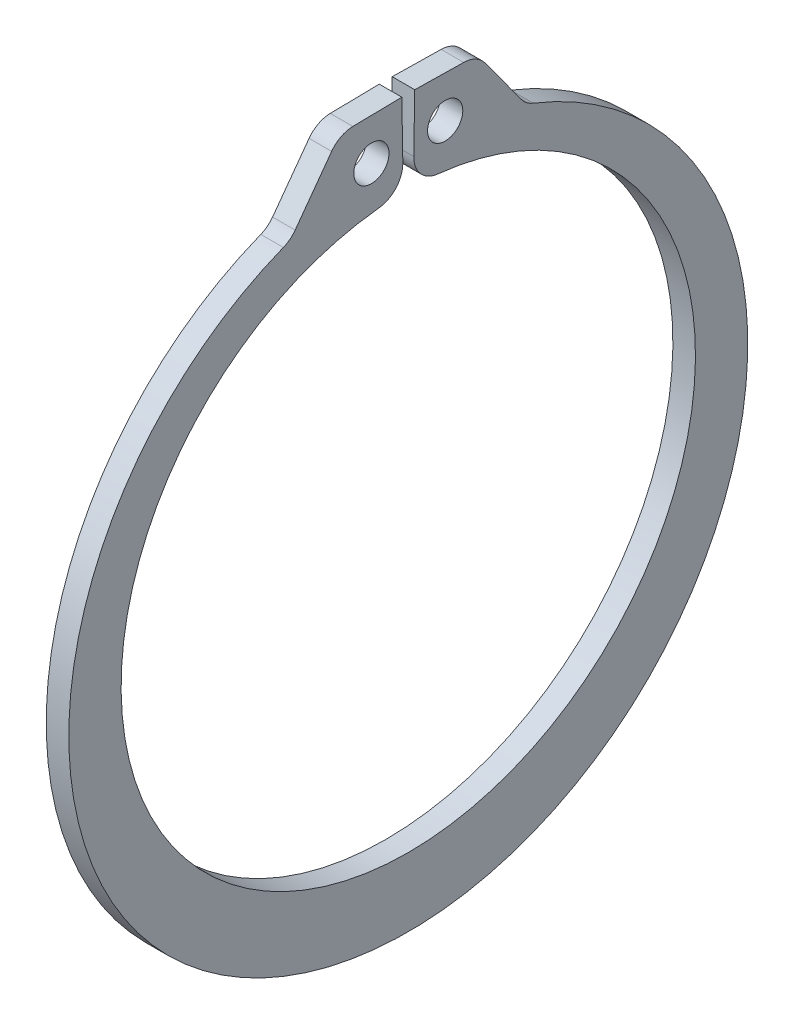
ISO-10303-21;
HEADER;
FILE_DESCRIPTION(('STEP AP214'),'2;1');
FILE_NAME('part.step','',(''),(''),'','','');
FILE_SCHEMA(('AUTOMOTIVE_DESIGN { 1 0 10303 214 1 1 1 1 }'));
ENDSEC;
DATA;
#1=APPLICATION_CONTEXT('core data for automotive mechanical design processes');
#2=APPLICATION_PROTOCOL_DEFINITION('international standard','automotive_design',2000,#1);
#3=PRODUCT_CONTEXT('',#1,'mechanical');
#4=PRODUCT('Part','Part','',(#3));
#5=PRODUCT_RELATED_PRODUCT_CATEGORY('part','',(#4));
#6=PRODUCT_DEFINITION_FORMATION('','',#4);
#7=PRODUCT_DEFINITION_CONTEXT('part definition',#1,'design');
#8=PRODUCT_DEFINITION('design','',#6,#7);
#9=PRODUCT_DEFINITION_SHAPE('','',#8);
#10=(LENGTH_UNIT() NAMED_UNIT(*) SI_UNIT(.MILLI.,.METRE.));
#11=(NAMED_UNIT(*) PLANE_ANGLE_UNIT() SI_UNIT($,.RADIAN.));
#12=(NAMED_UNIT(*) SI_UNIT($,.STERADIAN.) SOLID_ANGLE_UNIT());
#13=UNCERTAINTY_MEASURE_WITH_UNIT(LENGTH_MEASURE(1.E-05),#10,'distance_accuracy_value','');
#14=(GEOMETRIC_REPRESENTATION_CONTEXT(3) GLOBAL_UNCERTAINTY_ASSIGNED_CONTEXT((#13)) GLOBAL_UNIT_ASSIGNED_CONTEXT((#10,
#11,#12)) REPRESENTATION_CONTEXT('',''));
#15=CARTESIAN_POINT('',(0.,0.,0.));
#16=DIRECTION('',(0.,0.,1.));
#17=DIRECTION('',(1.,0.,0.));
#18=AXIS2_PLACEMENT_3D('',#15,#16,#17);
#19=CARTESIAN_POINT('',(0.635,-0.918943194300723,0.));
#20=DIRECTION('',(1.,0.,0.));
#21=DIRECTION('',(0.,0.,-1.));
#22=AXIS2_PLACEMENT_3D('',#19,#20,#21);
#23=PLANE('',#22);
#24=CARTESIAN_POINT('',(0.635,18.4577966131539,2.07504900844419));
#25=DIRECTION('',(1.,0.,0.));
#26=DIRECTION('',(0.,0.,-1.));
#27=AXIS2_PLACEMENT_3D('',#24,#25,#26);
#28=CIRCLE('',#27,0.990599999999999);
#29=CARTESIAN_POINT('',(0.635,18.4577966131539,1.08444900844419));
#30=VERTEX_POINT('',#29);
#31=EDGE_CURVE('E185',#30,#30,#28,.T.);
#32=ORIENTED_EDGE('',*,*,#31,.F.);
#33=EDGE_LOOP('',(#32));
#34=FACE_BOUND('',#33,.T.);
#35=DIRECTION('',(0.,0.807275838679021,0.590174313474488));
#36=VECTOR('',#35,1.);
#37=CARTESIAN_POINT('',(0.635,20.7636536196733,-3.86816486233792));
#38=LINE('',#37,#36);
#39=CARTESIAN_POINT('',(0.635,17.3506623233126,-6.36329688377948));
#40=VERTEX_POINT('',#39);
#41=CARTESIAN_POINT('',(0.635,20.157616095665,-4.31122008898346));
#42=VERTEX_POINT('',#41);
#43=EDGE_CURVE('E191',#40,#42,#38,.T.);
#44=ORIENTED_EDGE('',*,*,#43,.T.);
#45=CARTESIAN_POINT('',(0.635,19.265685655711,-3.09118411398786));
#46=DIRECTION('',(1.,0.,0.));
#47=DIRECTION('',(0.,0.,-1.));
#48=AXIS2_PLACEMENT_3D('',#45,#46,#47);
#49=CIRCLE('',#48,1.5113);
#50=CARTESIAN_POINT('',(0.635,20.7767554774009,-3.11755993583652));
#51=VERTEX_POINT('',#50);
#52=EDGE_CURVE('E230',#42,#51,#49,.T.);
#53=ORIENTED_EDGE('',*,*,#52,.T.);
#54=DIRECTION('',(0.,0.0174524064372835,0.999847695156391));
#55=VECTOR('',#54,1.);
#56=CARTESIAN_POINT('',(0.635,20.8248277947173,-0.363498721275741));
#57=LINE('',#56,#55);
#58=CARTESIAN_POINT('',(0.635,20.8248277947173,-0.363498721275741));
#59=VERTEX_POINT('',#58);
#60=EDGE_CURVE('E194',#51,#59,#57,.T.);
#61=ORIENTED_EDGE('',*,*,#60,.T.);
#62=DIRECTION('',(0.,-0.999847695156391,0.0174524064372839));
#63=VECTOR('',#62,1.);
#64=CARTESIAN_POINT('',(0.635,16.1519396066344,-0.28193315455045));
#65=LINE('',#64,#63);
#66=CARTESIAN_POINT('',(0.635,17.5982547446913,-0.307178679191898));
#67=VERTEX_POINT('',#66);
#68=EDGE_CURVE('E162',#59,#67,#65,.T.);
#69=ORIENTED_EDGE('',*,*,#68,.T.);
#70=CARTESIAN_POINT('',(0.635,17.5718789228426,-1.81824850088175));
#71=DIRECTION('',(1.,0.,0.));
#72=DIRECTION('',(0.,0.,-1.));
#73=AXIS2_PLACEMENT_3D('',#70,#71,#72);
#74=CIRCLE('',#73,1.5113);
#75=CARTESIAN_POINT('',(0.635,16.068605312621,-1.66269740698892));
#76=VERTEX_POINT('',#75);
#77=EDGE_CURVE('E228',#67,#76,#74,.T.);
#78=ORIENTED_EDGE('',*,*,#77,.T.);
#79=CARTESIAN_POINT('',(0.635,0.,0.));
#80=DIRECTION('',(-1.,0.,0.));
#81=DIRECTION('',(0.,0.,-1.));
#82=AXIS2_PLACEMENT_3D('',#79,#80,#81);
#83=CIRCLE('',#82,16.1544);
#84=CARTESIAN_POINT('',(0.635,16.068605312621,1.66269740698892));
#85=VERTEX_POINT('',#84);
#86=EDGE_CURVE('E197',#76,#85,#83,.T.);
#87=ORIENTED_EDGE('',*,*,#86,.T.);
#88=CARTESIAN_POINT('',(0.635,17.5718789228426,1.81824850088175));
#89=DIRECTION('',(1.,0.,0.));
#90=DIRECTION('',(0.,0.,-1.));
#91=AXIS2_PLACEMENT_3D('',#88,#89,#90);
#92=CIRCLE('',#91,1.5113);
#93=CARTESIAN_POINT('',(0.635,17.5982547446913,0.307178679191899));
#94=VERTEX_POINT('',#93);
#95=EDGE_CURVE('E226',#85,#94,#92,.T.);
#96=ORIENTED_EDGE('',*,*,#95,.T.);
#97=DIRECTION('',(0.,0.999847695156391,0.0174524064372836));
#98=VECTOR('',#97,1.);
#99=CARTESIAN_POINT('',(0.635,16.1519396066344,0.281933154550452));
#100=LINE('',#99,#98);
#101=CARTESIAN_POINT('',(0.635,20.8248277947173,0.363498721275741));
#102=VERTEX_POINT('',#101);
#103=EDGE_CURVE('E200',#94,#102,#100,.T.);
#104=ORIENTED_EDGE('',*,*,#103,.T.);
#105=DIRECTION('',(0.,-0.0174524064372835,0.999847695156391));
#106=VECTOR('',#105,1.);
#107=CARTESIAN_POINT('',(0.635,20.8248277947173,0.363498721275741));
#108=LINE('',#107,#106);
#109=CARTESIAN_POINT('',(0.635,20.7767554774009,3.11755993583652));
#110=VERTEX_POINT('',#109);
#111=EDGE_CURVE('E202',#102,#110,#108,.T.);
#112=ORIENTED_EDGE('',*,*,#111,.T.);
#113=CARTESIAN_POINT('',(0.635,19.265685655711,3.09118411398785));
#114=DIRECTION('',(1.,0.,0.));
#115=DIRECTION('',(0.,0.,-1.));
#116=AXIS2_PLACEMENT_3D('',#113,#114,#115);
#117=CIRCLE('',#116,1.5113);
#118=CARTESIAN_POINT('',(0.635,20.157616095665,4.31122008898346));
#119=VERTEX_POINT('',#118);
#120=EDGE_CURVE('E63',#110,#119,#117,.T.);
#121=ORIENTED_EDGE('',*,*,#120,.T.);
#122=DIRECTION('',(0.,-0.807275838679021,0.590174313474488));
#123=VECTOR('',#122,1.);
#124=CARTESIAN_POINT('',(0.635,20.7636536196733,3.86816486233792));
#125=LINE('',#124,#123);
#126=CARTESIAN_POINT('',(0.635,17.3506623233126,6.36329688377949));
#127=VERTEX_POINT('',#126);
#128=EDGE_CURVE('E204',#119,#127,#125,.T.);
#129=ORIENTED_EDGE('',*,*,#128,.T.);
#130=CARTESIAN_POINT('',(0.635,18.2425927632666,7.5833328587751));
#131=DIRECTION('',(1.,0.,0.));
#132=DIRECTION('',(0.,0.,-1.));
#133=AXIS2_PLACEMENT_3D('',#130,#131,#132);
#134=CIRCLE('',#133,1.5113);
#135=CARTESIAN_POINT('',(0.635,16.837339847275,7.02719264974764));
#136=VERTEX_POINT('',#135);
#137=EDGE_CURVE('E11',#127,#136,#134,.F.);
#138=ORIENTED_EDGE('',*,*,#137,.T.);
#139=CARTESIAN_POINT('',(0.635,-0.918943194300723,0.));
#140=DIRECTION('',(1.,0.,0.));
#141=DIRECTION('',(0.,0.,-1.));
#142=AXIS2_PLACEMENT_3D('',#139,#140,#141);
#143=CIRCLE('',#142,19.0962568056993);
#144=CARTESIAN_POINT('',(0.635,16.837339847275,-7.02719264974763));
#145=VERTEX_POINT('',#144);
#146=EDGE_CURVE('E188',#136,#145,#143,.T.);
#147=ORIENTED_EDGE('',*,*,#146,.T.);
#148=CARTESIAN_POINT('',(0.635,18.2425927632666,-7.58333285877509));
#149=DIRECTION('',(1.,0.,0.));
#150=DIRECTION('',(0.,0.,-1.));
#151=AXIS2_PLACEMENT_3D('',#148,#149,#150);
#152=CIRCLE('',#151,1.5113);
#153=EDGE_CURVE('E250',#145,#40,#152,.F.);
#154=ORIENTED_EDGE('',*,*,#153,.T.);
#155=EDGE_LOOP('',(#44,#53,#61,#69,#78,#87,#96,#104,#112,#121,#129,#138,#147,#154));
#156=FACE_BOUND('',#155,.T.);
#157=CARTESIAN_POINT('',(0.635,18.4577966131539,-2.07504900844419));
#158=DIRECTION('',(1.,0.,0.));
#159=DIRECTION('',(0.,0.,-1.));
#160=AXIS2_PLACEMENT_3D('',#157,#158,#159);
#161=CIRCLE('',#160,0.990599999999999);
#162=CARTESIAN_POINT('',(0.635,18.4577966131539,-3.06564900844419));
#163=VERTEX_POINT('',#162);
#164=EDGE_CURVE('E182',#163,#163,#161,.T.);
#165=ORIENTED_EDGE('',*,*,#164,.F.);
#166=EDGE_LOOP('',(#165));
#167=FACE_BOUND('',#166,.T.);
#168=ADVANCED_FACE('F41',(#34,#156,#167),#23,.T.);
#169=CARTESIAN_POINT('',(0.635,-0.918943194300723,0.));
#170=DIRECTION('',(-1.,0.,0.));
#171=DIRECTION('',(0.,0.,1.));
#172=AXIS2_PLACEMENT_3D('',#169,#170,#171);
#173=CYLINDRICAL_SURFACE('',#172,19.0962568056993);
#174=CARTESIAN_POINT('',(-0.635,-0.918943194300723,0.));
#175=DIRECTION('',(1.,0.,0.));
#176=DIRECTION('',(0.,0.,-1.));
#177=AXIS2_PLACEMENT_3D('',#174,#175,#176);
#178=CIRCLE('',#177,19.0962568056993);
#179=CARTESIAN_POINT('',(-0.635,16.837339847275,7.02719264974764));
#180=VERTEX_POINT('',#179);
#181=CARTESIAN_POINT('',(-0.635,16.837339847275,-7.02719264974763));
#182=VERTEX_POINT('',#181);
#183=EDGE_CURVE('E254',#180,#182,#178,.T.);
#184=ORIENTED_EDGE('',*,*,#183,.T.);
#185=DIRECTION('',(-1.,0.,0.));
#186=VECTOR('',#185,1.);
#187=CARTESIAN_POINT('',(0.635,16.837339847275,-7.02719264974763));
#188=LINE('',#187,#186);
#189=EDGE_CURVE('E215',#182,#145,#188,.F.);
#190=ORIENTED_EDGE('',*,*,#189,.T.);
#191=ORIENTED_EDGE('',*,*,#146,.F.);
#192=DIRECTION('',(-1.,0.,0.));
#193=VECTOR('',#192,1.);
#194=CARTESIAN_POINT('',(0.635,16.837339847275,7.02719264974764));
#195=LINE('',#194,#193);
#196=EDGE_CURVE('E212',#136,#180,#195,.T.);
#197=ORIENTED_EDGE('',*,*,#196,.T.);
#198=EDGE_LOOP('',(#184,#190,#191,#197));
#199=FACE_BOUND('',#198,.T.);
#200=ADVANCED_FACE('F264',(#199),#173,.T.);
#201=CARTESIAN_POINT('',(0.635,20.7636536196733,-3.86816486233792));
#202=DIRECTION('',(0.,-0.590174313474488,0.807275838679021));
#203=DIRECTION('',(0.,-0.807275838679021,-0.590174313474488));
#204=AXIS2_PLACEMENT_3D('',#201,#202,#203);
#205=PLANE('',#204);
#206=ORIENTED_EDGE('',*,*,#43,.F.);
#207=DIRECTION('',(1.,0.,0.));
#208=VECTOR('',#207,1.);
#209=CARTESIAN_POINT('',(-0.635,17.3506623233126,-6.36329688377948));
#210=LINE('',#209,#208);
#211=CARTESIAN_POINT('',(-0.635,17.3506623233126,-6.36329688377948));
#212=VERTEX_POINT('',#211);
#213=EDGE_CURVE('E209',#40,#212,#210,.F.);
#214=ORIENTED_EDGE('',*,*,#213,.T.);
#215=DIRECTION('',(0.,0.807275838679021,0.590174313474488));
#216=VECTOR('',#215,1.);
#217=CARTESIAN_POINT('',(-0.635,20.7636536196733,-3.86816486233792));
#218=LINE('',#217,#216);
#219=CARTESIAN_POINT('',(-0.635,20.157616095665,-4.31122008898346));
#220=VERTEX_POINT('',#219);
#221=EDGE_CURVE('E155',#212,#220,#218,.T.);
#222=ORIENTED_EDGE('',*,*,#221,.T.);
#223=DIRECTION('',(-1.,0.,0.));
#224=VECTOR('',#223,1.);
#225=CARTESIAN_POINT('',(0.635,20.157616095665,-4.31122008898346));
#226=LINE('',#225,#224);
#227=EDGE_CURVE('E163',#220,#42,#226,.F.);
#228=ORIENTED_EDGE('',*,*,#227,.T.);
#229=EDGE_LOOP('',(#206,#214,#222,#228));
#230=FACE_BOUND('',#229,.T.);
#231=ADVANCED_FACE('F272',(#230),#205,.F.);
#232=CARTESIAN_POINT('',(0.635,20.8248277947173,-0.363498721275741));
#233=DIRECTION('',(0.,-0.999847695156391,0.0174524064372835));
#234=DIRECTION('',(0.,-0.0174524064372835,-0.999847695156391));
#235=AXIS2_PLACEMENT_3D('',#232,#233,#234);
#236=PLANE('',#235);
#237=ORIENTED_EDGE('',*,*,#60,.F.);
#238=DIRECTION('',(-1.,0.,0.));
#239=VECTOR('',#238,1.);
#240=CARTESIAN_POINT('',(0.635,20.7767554774009,-3.11755993583652));
#241=LINE('',#240,#239);
#242=CARTESIAN_POINT('',(-0.635,20.7767554774009,-3.11755993583652));
#243=VERTEX_POINT('',#242);
#244=EDGE_CURVE('E151',#51,#243,#241,.T.);
#245=ORIENTED_EDGE('',*,*,#244,.T.);
#246=DIRECTION('',(0.,0.0174524064372835,0.999847695156391));
#247=VECTOR('',#246,1.);
#248=CARTESIAN_POINT('',(-0.635,20.8248277947173,-0.363498721275741));
#249=LINE('',#248,#247);
#250=CARTESIAN_POINT('',(-0.635,20.8248277947173,-0.363498721275741));
#251=VERTEX_POINT('',#250);
#252=EDGE_CURVE('E144',#243,#251,#249,.T.);
#253=ORIENTED_EDGE('',*,*,#252,.T.);
#254=DIRECTION('',(-1.,0.,0.));
#255=VECTOR('',#254,1.);
#256=CARTESIAN_POINT('',(0.635,20.8248277947173,-0.363498721275741));
#257=LINE('',#256,#255);
#258=EDGE_CURVE('E148',#59,#251,#257,.T.);
#259=ORIENTED_EDGE('',*,*,#258,.F.);
#260=EDGE_LOOP('',(#237,#245,#253,#259));
#261=FACE_BOUND('',#260,.T.);
#262=ADVANCED_FACE('F147',(#261),#236,.F.);
#263=CARTESIAN_POINT('',(0.635,16.1519396066344,-0.28193315455045));
#264=DIRECTION('',(0.,-0.0174524064372839,-0.999847695156391));
#265=DIRECTION('',(0.,0.999847695156391,-0.0174524064372839));
#266=AXIS2_PLACEMENT_3D('',#263,#264,#265);
#267=PLANE('',#266);
#268=DIRECTION('',(0.,-0.999847695156391,0.0174524064372839));
#269=VECTOR('',#268,1.);
#270=CARTESIAN_POINT('',(-0.635,16.1519396066344,-0.28193315455045));
#271=LINE('',#270,#269);
#272=CARTESIAN_POINT('',(-0.635,17.5982547446913,-0.307178679191898));
#273=VERTEX_POINT('',#272);
#274=EDGE_CURVE('E154',#251,#273,#271,.T.);
#275=ORIENTED_EDGE('',*,*,#274,.T.);
#276=DIRECTION('',(-1.,0.,0.));
#277=VECTOR('',#276,1.);
#278=CARTESIAN_POINT('',(0.635,17.5982547446913,-0.307178679191898));
#279=LINE('',#278,#277);
#280=EDGE_CURVE('E237',#273,#67,#279,.F.);
#281=ORIENTED_EDGE('',*,*,#280,.T.);
#282=ORIENTED_EDGE('',*,*,#68,.F.);
#283=ORIENTED_EDGE('',*,*,#258,.T.);
#284=EDGE_LOOP('',(#275,#281,#282,#283));
#285=FACE_BOUND('',#284,.T.);
#286=ADVANCED_FACE('F159',(#285),#267,.F.);
#287=CARTESIAN_POINT('',(0.635,0.,0.));
#288=DIRECTION('',(-1.,0.,0.));
#289=DIRECTION('',(0.,0.,1.));
#290=AXIS2_PLACEMENT_3D('',#287,#288,#289);
#291=CYLINDRICAL_SURFACE('',#290,16.1544);
#292=ORIENTED_EDGE('',*,*,#86,.F.);
#293=DIRECTION('',(-1.,0.,0.));
#294=VECTOR('',#293,1.);
#295=CARTESIAN_POINT('',(0.635,16.068605312621,-1.66269740698892));
#296=LINE('',#295,#294);
#297=CARTESIAN_POINT('',(-0.635,16.068605312621,-1.66269740698892));
#298=VERTEX_POINT('',#297);
#299=EDGE_CURVE('E234',#76,#298,#296,.T.);
#300=ORIENTED_EDGE('',*,*,#299,.T.);
#301=CARTESIAN_POINT('',(-0.635,0.,0.));
#302=DIRECTION('',(-1.,0.,0.));
#303=DIRECTION('',(0.,0.,-1.));
#304=AXIS2_PLACEMENT_3D('',#301,#302,#303);
#305=CIRCLE('',#304,16.1544);
#306=CARTESIAN_POINT('',(-0.635,16.068605312621,1.66269740698892));
#307=VERTEX_POINT('',#306);
#308=EDGE_CURVE('E169',#298,#307,#305,.T.);
#309=ORIENTED_EDGE('',*,*,#308,.T.);
#310=DIRECTION('',(-1.,0.,0.));
#311=VECTOR('',#310,1.);
#312=CARTESIAN_POINT('',(0.635,16.068605312621,1.66269740698892));
#313=LINE('',#312,#311);
#314=EDGE_CURVE('E232',#307,#85,#313,.F.);
#315=ORIENTED_EDGE('',*,*,#314,.T.);
#316=EDGE_LOOP('',(#292,#300,#309,#315));
#317=FACE_BOUND('',#316,.T.);
#318=ADVANCED_FACE('F284',(#317),#291,.F.);
#319=CARTESIAN_POINT('',(0.635,16.1519396066344,0.281933154550452));
#320=DIRECTION('',(0.,-0.0174524064372836,0.999847695156391));
#321=DIRECTION('',(0.,-0.999847695156391,-0.0174524064372836));
#322=AXIS2_PLACEMENT_3D('',#319,#320,#321);
#323=PLANE('',#322);
#324=ORIENTED_EDGE('',*,*,#103,.F.);
#325=DIRECTION('',(-1.,0.,0.));
#326=VECTOR('',#325,1.);
#327=CARTESIAN_POINT('',(0.635,17.5982547446913,0.307178679191899));
#328=LINE('',#327,#326);
#329=CARTESIAN_POINT('',(-0.635,17.5982547446913,0.307178679191899));
#330=VERTEX_POINT('',#329);
#331=EDGE_CURVE('E239',#94,#330,#328,.T.);
#332=ORIENTED_EDGE('',*,*,#331,.T.);
#333=DIRECTION('',(0.,0.999847695156391,0.0174524064372836));
#334=VECTOR('',#333,1.);
#335=CARTESIAN_POINT('',(-0.635,16.1519396066344,0.281933154550452));
#336=LINE('',#335,#334);
#337=CARTESIAN_POINT('',(-0.635,20.8248277947173,0.363498721275741));
#338=VERTEX_POINT('',#337);
#339=EDGE_CURVE('E172',#330,#338,#336,.T.);
#340=ORIENTED_EDGE('',*,*,#339,.T.);
#341=DIRECTION('',(-1.,0.,0.));
#342=VECTOR('',#341,1.);
#343=CARTESIAN_POINT('',(0.635,20.8248277947173,0.363498721275741));
#344=LINE('',#343,#342);
#345=EDGE_CURVE('E164',#102,#338,#344,.T.);
#346=ORIENTED_EDGE('',*,*,#345,.F.);
#347=EDGE_LOOP('',(#324,#332,#340,#346));
#348=FACE_BOUND('',#347,.T.);
#349=ADVANCED_FACE('F294',(#348),#323,.F.);
#350=CARTESIAN_POINT('',(0.635,20.8248277947173,0.363498721275741));
#351=DIRECTION('',(0.,-0.999847695156391,-0.0174524064372835));
#352=DIRECTION('',(0.,0.0174524064372835,-0.999847695156391));
#353=AXIS2_PLACEMENT_3D('',#350,#351,#352);
#354=PLANE('',#353);
#355=DIRECTION('',(0.,-0.0174524064372835,0.999847695156391));
#356=VECTOR('',#355,1.);
#357=CARTESIAN_POINT('',(-0.635,20.8248277947173,0.363498721275741));
#358=LINE('',#357,#356);
#359=CARTESIAN_POINT('',(-0.635,20.7767554774009,3.11755993583652));
#360=VERTEX_POINT('',#359);
#361=EDGE_CURVE('E177',#338,#360,#358,.T.);
#362=ORIENTED_EDGE('',*,*,#361,.T.);
#363=DIRECTION('',(-1.,0.,0.));
#364=VECTOR('',#363,1.);
#365=CARTESIAN_POINT('',(0.635,20.7767554774009,3.11755993583652));
#366=LINE('',#365,#364);
#367=EDGE_CURVE('E246',#360,#110,#366,.F.);
#368=ORIENTED_EDGE('',*,*,#367,.T.);
#369=ORIENTED_EDGE('',*,*,#111,.F.);
#370=ORIENTED_EDGE('',*,*,#345,.T.);
#371=EDGE_LOOP('',(#362,#368,#369,#370));
#372=FACE_BOUND('',#371,.T.);
#373=ADVANCED_FACE('F301',(#372),#354,.F.);
#374=CARTESIAN_POINT('',(0.635,20.7636536196733,3.86816486233792));
#375=DIRECTION('',(0.,-0.590174313474488,-0.807275838679021));
#376=DIRECTION('',(0.,0.807275838679021,-0.590174313474488));
#377=AXIS2_PLACEMENT_3D('',#374,#375,#376);
#378=PLANE('',#377);
#379=ORIENTED_EDGE('',*,*,#128,.F.);
#380=DIRECTION('',(-1.,0.,0.));
#381=VECTOR('',#380,1.);
#382=CARTESIAN_POINT('',(0.635,20.157616095665,4.31122008898346));
#383=LINE('',#382,#381);
#384=CARTESIAN_POINT('',(-0.635,20.157616095665,4.31122008898346));
#385=VERTEX_POINT('',#384);
#386=EDGE_CURVE('E243',#119,#385,#383,.T.);
#387=ORIENTED_EDGE('',*,*,#386,.T.);
#388=DIRECTION('',(0.,-0.807275838679021,0.590174313474488));
#389=VECTOR('',#388,1.);
#390=CARTESIAN_POINT('',(-0.635,20.7636536196733,3.86816486233792));
#391=LINE('',#390,#389);
#392=CARTESIAN_POINT('',(-0.635,17.3506623233126,6.36329688377949));
#393=VERTEX_POINT('',#392);
#394=EDGE_CURVE('E180',#385,#393,#391,.T.);
#395=ORIENTED_EDGE('',*,*,#394,.T.);
#396=DIRECTION('',(1.,0.,0.));
#397=VECTOR('',#396,1.);
#398=CARTESIAN_POINT('',(0.635,17.3506623233126,6.36329688377949));
#399=LINE('',#398,#397);
#400=EDGE_CURVE('E56',#393,#127,#399,.T.);
#401=ORIENTED_EDGE('',*,*,#400,.T.);
#402=EDGE_LOOP('',(#379,#387,#395,#401));
#403=FACE_BOUND('',#402,.T.);
#404=ADVANCED_FACE('F257',(#403),#378,.F.);
#405=CARTESIAN_POINT('',(0.635,18.4577966131539,2.07504900844419));
#406=DIRECTION('',(-1.,0.,0.));
#407=DIRECTION('',(0.,0.,1.));
#408=AXIS2_PLACEMENT_3D('',#405,#406,#407);
#409=CYLINDRICAL_SURFACE('',#408,0.990599999999999);
#410=ORIENTED_EDGE('',*,*,#31,.T.);
#411=EDGE_LOOP('',(#410));
#412=FACE_BOUND('',#411,.T.);
#413=CARTESIAN_POINT('',(-0.635,18.4577966131539,2.07504900844419));
#414=DIRECTION('',(1.,0.,0.));
#415=DIRECTION('',(0.,0.,-1.));
#416=AXIS2_PLACEMENT_3D('',#413,#414,#415);
#417=CIRCLE('',#416,0.990599999999999);
#418=CARTESIAN_POINT('',(-0.635,18.4577966131539,1.08444900844419));
#419=VERTEX_POINT('',#418);
#420=EDGE_CURVE('E339',#419,#419,#417,.T.);
#421=ORIENTED_EDGE('',*,*,#420,.F.);
#422=EDGE_LOOP('',(#421));
#423=FACE_BOUND('',#422,.T.);
#424=ADVANCED_FACE('F308',(#412,#423),#409,.F.);
#425=CARTESIAN_POINT('',(0.635,18.4577966131539,-2.07504900844419));
#426=DIRECTION('',(-1.,0.,0.));
#427=DIRECTION('',(0.,0.,1.));
#428=AXIS2_PLACEMENT_3D('',#425,#426,#427);
#429=CYLINDRICAL_SURFACE('',#428,0.990599999999999);
#430=ORIENTED_EDGE('',*,*,#164,.T.);
#431=EDGE_LOOP('',(#430));
#432=FACE_BOUND('',#431,.T.);
#433=CARTESIAN_POINT('',(-0.635,18.4577966131539,-2.07504900844419));
#434=DIRECTION('',(1.,0.,0.));
#435=DIRECTION('',(0.,0.,-1.));
#436=AXIS2_PLACEMENT_3D('',#433,#434,#435);
#437=CIRCLE('',#436,0.990599999999999);
#438=CARTESIAN_POINT('',(-0.635,18.4577966131539,-3.06564900844419));
#439=VERTEX_POINT('',#438);
#440=EDGE_CURVE('E336',#439,#439,#437,.T.);
#441=ORIENTED_EDGE('',*,*,#440,.F.);
#442=EDGE_LOOP('',(#441));
#443=FACE_BOUND('',#442,.T.);
#444=ADVANCED_FACE('F323',(#432,#443),#429,.F.);
#445=CARTESIAN_POINT('',(-0.635,-0.918943194300723,0.));
#446=DIRECTION('',(1.,0.,0.));
#447=DIRECTION('',(0.,0.,-1.));
#448=AXIS2_PLACEMENT_3D('',#445,#446,#447);
#449=PLANE('',#448);
#450=ORIENTED_EDGE('',*,*,#440,.T.);
#451=EDGE_LOOP('',(#450));
#452=FACE_BOUND('',#451,.T.);
#453=ORIENTED_EDGE('',*,*,#420,.T.);
#454=EDGE_LOOP('',(#453));
#455=FACE_BOUND('',#454,.T.);
#456=ORIENTED_EDGE('',*,*,#252,.F.);
#457=CARTESIAN_POINT('',(-0.635,19.265685655711,-3.09118411398786));
#458=DIRECTION('',(1.,0.,0.));
#459=DIRECTION('',(0.,0.,-1.));
#460=AXIS2_PLACEMENT_3D('',#457,#458,#459);
#461=CIRCLE('',#460,1.5113);
#462=EDGE_CURVE('E223',#243,#220,#461,.F.);
#463=ORIENTED_EDGE('',*,*,#462,.T.);
#464=ORIENTED_EDGE('',*,*,#221,.F.);
#465=CARTESIAN_POINT('',(-0.635,18.2425927632666,-7.58333285877509));
#466=DIRECTION('',(1.,0.,0.));
#467=DIRECTION('',(0.,0.,-1.));
#468=AXIS2_PLACEMENT_3D('',#465,#466,#467);
#469=CIRCLE('',#468,1.5113);
#470=EDGE_CURVE('E248',#212,#182,#469,.T.);
#471=ORIENTED_EDGE('',*,*,#470,.T.);
#472=ORIENTED_EDGE('',*,*,#183,.F.);
#473=CARTESIAN_POINT('',(-0.635,18.2425927632666,7.5833328587751));
#474=DIRECTION('',(1.,0.,0.));
#475=DIRECTION('',(0.,0.,-1.));
#476=AXIS2_PLACEMENT_3D('',#473,#474,#475);
#477=CIRCLE('',#476,1.5113);
#478=EDGE_CURVE('E49',#180,#393,#477,.T.);
#479=ORIENTED_EDGE('',*,*,#478,.T.);
#480=ORIENTED_EDGE('',*,*,#394,.F.);
#481=CARTESIAN_POINT('',(-0.635,19.265685655711,3.09118411398785));
#482=DIRECTION('',(1.,0.,0.));
#483=DIRECTION('',(0.,0.,-1.));
#484=AXIS2_PLACEMENT_3D('',#481,#482,#483);
#485=CIRCLE('',#484,1.5113);
#486=EDGE_CURVE('E218',#385,#360,#485,.F.);
#487=ORIENTED_EDGE('',*,*,#486,.T.);
#488=ORIENTED_EDGE('',*,*,#361,.F.);
#489=ORIENTED_EDGE('',*,*,#339,.F.);
#490=CARTESIAN_POINT('',(-0.635,17.5718789228426,1.81824850088175));
#491=DIRECTION('',(1.,0.,0.));
#492=DIRECTION('',(0.,0.,-1.));
#493=AXIS2_PLACEMENT_3D('',#490,#491,#492);
#494=CIRCLE('',#493,1.5113);
#495=EDGE_CURVE('E220',#330,#307,#494,.F.);
#496=ORIENTED_EDGE('',*,*,#495,.T.);
#497=ORIENTED_EDGE('',*,*,#308,.F.);
#498=CARTESIAN_POINT('',(-0.635,17.5718789228426,-1.81824850088175));
#499=DIRECTION('',(1.,0.,0.));
#500=DIRECTION('',(0.,0.,-1.));
#501=AXIS2_PLACEMENT_3D('',#498,#499,#500);
#502=CIRCLE('',#501,1.5113);
#503=EDGE_CURVE('E168',#298,#273,#502,.F.);
#504=ORIENTED_EDGE('',*,*,#503,.T.);
#505=ORIENTED_EDGE('',*,*,#274,.F.);
#506=EDGE_LOOP('',(#456,#463,#464,#471,#472,#479,#480,#487,#488,#489,#496,#497,#504,#505));
#507=FACE_BOUND('',#506,.T.);
#508=ADVANCED_FACE('F166',(#452,#455,#507),#449,.F.);
#509=CARTESIAN_POINT('',(0.635,18.2425927632666,-7.58333285877509));
#510=DIRECTION('',(-1.,0.,0.));
#511=DIRECTION('',(0.,0.,1.));
#512=AXIS2_PLACEMENT_3D('',#509,#510,#511);
#513=CYLINDRICAL_SURFACE('',#512,1.5113);
#514=ORIENTED_EDGE('',*,*,#153,.F.);
#515=ORIENTED_EDGE('',*,*,#189,.F.);
#516=ORIENTED_EDGE('',*,*,#470,.F.);
#517=ORIENTED_EDGE('',*,*,#213,.F.);
#518=EDGE_LOOP('',(#514,#515,#516,#517));
#519=FACE_BOUND('',#518,.T.);
#520=ADVANCED_FACE('F267',(#519),#513,.F.);
#521=CARTESIAN_POINT('',(0.635,19.265685655711,-3.09118411398786));
#522=DIRECTION('',(-1.,0.,0.));
#523=DIRECTION('',(0.,0.,1.));
#524=AXIS2_PLACEMENT_3D('',#521,#522,#523);
#525=CYLINDRICAL_SURFACE('',#524,1.5113);
#526=ORIENTED_EDGE('',*,*,#52,.F.);
#527=ORIENTED_EDGE('',*,*,#227,.F.);
#528=ORIENTED_EDGE('',*,*,#462,.F.);
#529=ORIENTED_EDGE('',*,*,#244,.F.);
#530=EDGE_LOOP('',(#526,#527,#528,#529));
#531=FACE_BOUND('',#530,.T.);
#532=ADVANCED_FACE('F277',(#531),#525,.T.);
#533=CARTESIAN_POINT('',(0.635,17.5718789228426,-1.81824850088175));
#534=DIRECTION('',(-1.,0.,0.));
#535=DIRECTION('',(0.,0.,1.));
#536=AXIS2_PLACEMENT_3D('',#533,#534,#535);
#537=CYLINDRICAL_SURFACE('',#536,1.5113);
#538=ORIENTED_EDGE('',*,*,#77,.F.);
#539=ORIENTED_EDGE('',*,*,#280,.F.);
#540=ORIENTED_EDGE('',*,*,#503,.F.);
#541=ORIENTED_EDGE('',*,*,#299,.F.);
#542=EDGE_LOOP('',(#538,#539,#540,#541));
#543=FACE_BOUND('',#542,.T.);
#544=ADVANCED_FACE('F282',(#543),#537,.T.);
#545=CARTESIAN_POINT('',(0.635,17.5718789228426,1.81824850088175));
#546=DIRECTION('',(-1.,0.,0.));
#547=DIRECTION('',(0.,0.,1.));
#548=AXIS2_PLACEMENT_3D('',#545,#546,#547);
#549=CYLINDRICAL_SURFACE('',#548,1.5113);
#550=ORIENTED_EDGE('',*,*,#95,.F.);
#551=ORIENTED_EDGE('',*,*,#314,.F.);
#552=ORIENTED_EDGE('',*,*,#495,.F.);
#553=ORIENTED_EDGE('',*,*,#331,.F.);
#554=EDGE_LOOP('',(#550,#551,#552,#553));
#555=FACE_BOUND('',#554,.T.);
#556=ADVANCED_FACE('F291',(#555),#549,.T.);
#557=CARTESIAN_POINT('',(0.635,19.265685655711,3.09118411398785));
#558=DIRECTION('',(-1.,0.,0.));
#559=DIRECTION('',(0.,0.,1.));
#560=AXIS2_PLACEMENT_3D('',#557,#558,#559);
#561=CYLINDRICAL_SURFACE('',#560,1.5113);
#562=ORIENTED_EDGE('',*,*,#120,.F.);
#563=ORIENTED_EDGE('',*,*,#367,.F.);
#564=ORIENTED_EDGE('',*,*,#486,.F.);
#565=ORIENTED_EDGE('',*,*,#386,.F.);
#566=EDGE_LOOP('',(#562,#563,#564,#565));
#567=FACE_BOUND('',#566,.T.);
#568=ADVANCED_FACE('F300',(#567),#561,.T.);
#569=CARTESIAN_POINT('',(0.635,18.2425927632666,7.5833328587751));
#570=DIRECTION('',(-1.,0.,0.));
#571=DIRECTION('',(0.,0.,1.));
#572=AXIS2_PLACEMENT_3D('',#569,#570,#571);
#573=CYLINDRICAL_SURFACE('',#572,1.5113);
#574=ORIENTED_EDGE('',*,*,#137,.F.);
#575=ORIENTED_EDGE('',*,*,#400,.F.);
#576=ORIENTED_EDGE('',*,*,#478,.F.);
#577=ORIENTED_EDGE('',*,*,#196,.F.);
#578=EDGE_LOOP('',(#574,#575,#576,#577));
#579=FACE_BOUND('',#578,.T.);
#580=ADVANCED_FACE('F43',(#579),#573,.F.);
#581=CLOSED_SHELL('',(#168,#200,#231,#262,#286,#318,#349,#373,#404,#424,#444,#508,#520,#532,
#544,#556,#568,#580));
#582=MANIFOLD_SOLID_BREP('B2',#581);
#583=ADVANCED_BREP_SHAPE_REPRESENTATION('',(#18,#582),#14);
#584=SHAPE_DEFINITION_REPRESENTATION(#9,#583);
ENDSEC;
END-ISO-10303-21;
